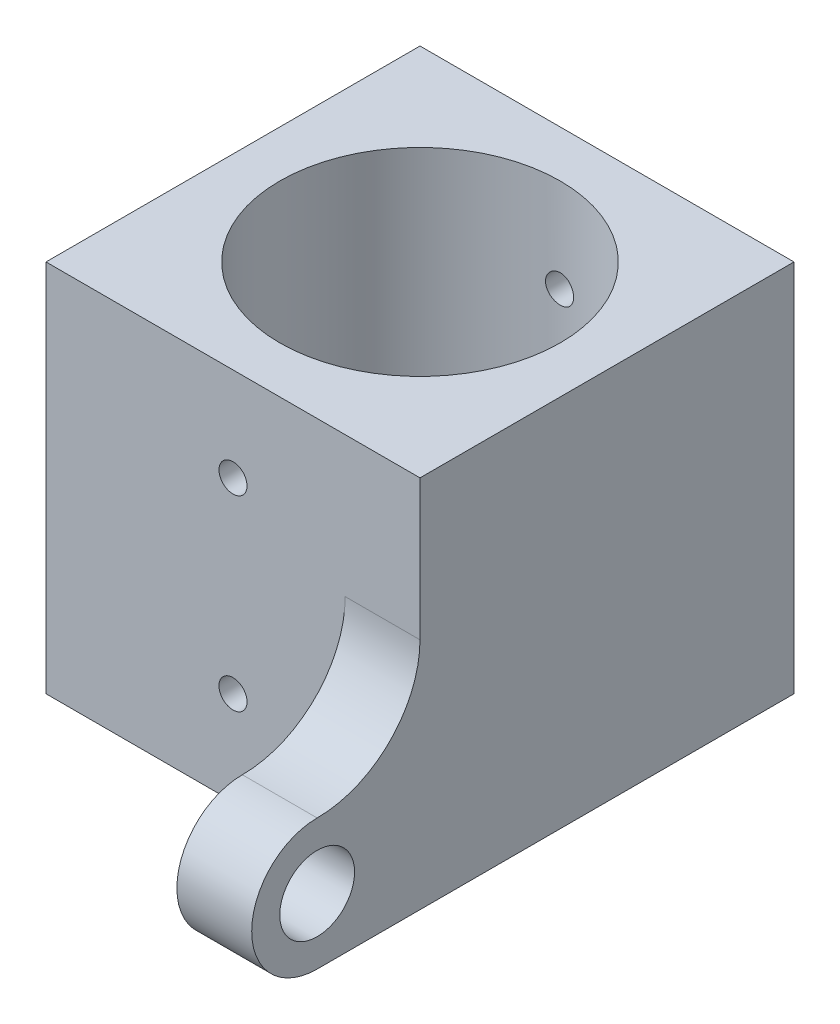
ISO-10303-21;
HEADER;
FILE_DESCRIPTION(('STEP AP214'),'2;1');
FILE_NAME('part.step','',(''),(''),'','','');
FILE_SCHEMA(('AUTOMOTIVE_DESIGN { 1 0 10303 214 1 1 1 1 }'));
ENDSEC;
DATA;
#1=APPLICATION_CONTEXT('core data for automotive mechanical design processes');
#2=APPLICATION_PROTOCOL_DEFINITION('international standard','automotive_design',2000,#1);
#3=PRODUCT_CONTEXT('',#1,'mechanical');
#4=PRODUCT('Part','Part','',(#3));
#5=PRODUCT_RELATED_PRODUCT_CATEGORY('part','',(#4));
#6=PRODUCT_DEFINITION_FORMATION('','',#4);
#7=PRODUCT_DEFINITION_CONTEXT('part definition',#1,'design');
#8=PRODUCT_DEFINITION('design','',#6,#7);
#9=PRODUCT_DEFINITION_SHAPE('','',#8);
#10=(LENGTH_UNIT() NAMED_UNIT(*) SI_UNIT(.MILLI.,.METRE.));
#11=(NAMED_UNIT(*) PLANE_ANGLE_UNIT() SI_UNIT($,.RADIAN.));
#12=(NAMED_UNIT(*) SI_UNIT($,.STERADIAN.) SOLID_ANGLE_UNIT());
#13=UNCERTAINTY_MEASURE_WITH_UNIT(LENGTH_MEASURE(1.E-05),#10,'distance_accuracy_value','');
#14=(GEOMETRIC_REPRESENTATION_CONTEXT(3) GLOBAL_UNCERTAINTY_ASSIGNED_CONTEXT((#13)) GLOBAL_UNIT_ASSIGNED_CONTEXT((#10,
#11,#12)) REPRESENTATION_CONTEXT('',''));
#15=CARTESIAN_POINT('',(0.,0.,0.));
#16=DIRECTION('',(0.,0.,1.));
#17=DIRECTION('',(1.,0.,0.));
#18=AXIS2_PLACEMENT_3D('',#15,#16,#17);
#19=CARTESIAN_POINT('',(0.,40.,0.));
#20=DIRECTION('',(0.,1.,0.));
#21=DIRECTION('',(0.,0.,1.));
#22=AXIS2_PLACEMENT_3D('',#19,#20,#21);
#23=PLANE('',#22);
#24=DIRECTION('',(0.,0.,-1.));
#25=VECTOR('',#24,1.);
#26=CARTESIAN_POINT('',(20.,40.,-20.));
#27=LINE('',#26,#25);
#28=CARTESIAN_POINT('',(20.,40.,20.));
#29=VERTEX_POINT('',#28);
#30=CARTESIAN_POINT('',(20.,40.,-20.));
#31=VERTEX_POINT('',#30);
#32=EDGE_CURVE('E207',#29,#31,#27,.T.);
#33=ORIENTED_EDGE('',*,*,#32,.T.);
#34=DIRECTION('',(-1.,0.,0.));
#35=VECTOR('',#34,1.);
#36=CARTESIAN_POINT('',(-20.,40.,-20.));
#37=LINE('',#36,#35);
#38=CARTESIAN_POINT('',(-20.,40.,-20.));
#39=VERTEX_POINT('',#38);
#40=EDGE_CURVE('E211',#31,#39,#37,.T.);
#41=ORIENTED_EDGE('',*,*,#40,.T.);
#42=DIRECTION('',(0.,0.,1.));
#43=VECTOR('',#42,1.);
#44=CARTESIAN_POINT('',(-20.,40.,-20.));
#45=LINE('',#44,#43);
#46=CARTESIAN_POINT('',(-20.,40.,20.));
#47=VERTEX_POINT('',#46);
#48=EDGE_CURVE('E215',#39,#47,#45,.T.);
#49=ORIENTED_EDGE('',*,*,#48,.T.);
#50=DIRECTION('',(1.,0.,0.));
#51=VECTOR('',#50,1.);
#52=CARTESIAN_POINT('',(-20.,40.,20.));
#53=LINE('',#52,#51);
#54=EDGE_CURVE('E218',#47,#29,#53,.T.);
#55=ORIENTED_EDGE('',*,*,#54,.T.);
#56=EDGE_LOOP('',(#33,#41,#49,#55));
#57=FACE_BOUND('',#56,.T.);
#58=CARTESIAN_POINT('',(0.,40.,0.));
#59=DIRECTION('',(0.,1.,0.));
#60=DIRECTION('',(0.,0.,1.));
#61=AXIS2_PLACEMENT_3D('',#58,#59,#60);
#62=CIRCLE('',#61,15.);
#63=CARTESIAN_POINT('',(0.,40.,15.));
#64=VERTEX_POINT('',#63);
#65=EDGE_CURVE('E199',#64,#64,#62,.T.);
#66=ORIENTED_EDGE('',*,*,#65,.F.);
#67=EDGE_LOOP('',(#66));
#68=FACE_BOUND('',#67,.T.);
#69=ADVANCED_FACE('F39',(#57,#68),#23,.T.);
#70=CARTESIAN_POINT('',(0.,0.,0.));
#71=DIRECTION('',(0.,1.,0.));
#72=DIRECTION('',(0.,0.,1.));
#73=AXIS2_PLACEMENT_3D('',#70,#71,#72);
#74=PLANE('',#73);
#75=DIRECTION('',(0.,0.,-1.));
#76=VECTOR('',#75,1.);
#77=CARTESIAN_POINT('',(20.,0.,-20.));
#78=LINE('',#77,#76);
#79=CARTESIAN_POINT('',(20.,0.,31.));
#80=VERTEX_POINT('',#79);
#81=CARTESIAN_POINT('',(20.,0.,-20.));
#82=VERTEX_POINT('',#81);
#83=EDGE_CURVE('E203',#80,#82,#78,.T.);
#84=ORIENTED_EDGE('',*,*,#83,.F.);
#85=DIRECTION('',(1.,0.,0.));
#86=VECTOR('',#85,1.);
#87=CARTESIAN_POINT('',(12.,0.,31.));
#88=LINE('',#87,#86);
#89=CARTESIAN_POINT('',(12.,0.,31.));
#90=VERTEX_POINT('',#89);
#91=EDGE_CURVE('E108',#90,#80,#88,.T.);
#92=ORIENTED_EDGE('',*,*,#91,.F.);
#93=DIRECTION('',(0.,0.,-1.));
#94=VECTOR('',#93,1.);
#95=CARTESIAN_POINT('',(12.,0.,20.));
#96=LINE('',#95,#94);
#97=CARTESIAN_POINT('',(12.,0.,20.));
#98=VERTEX_POINT('',#97);
#99=EDGE_CURVE('E109',#90,#98,#96,.T.);
#100=ORIENTED_EDGE('',*,*,#99,.T.);
#101=DIRECTION('',(1.,0.,0.));
#102=VECTOR('',#101,1.);
#103=CARTESIAN_POINT('',(-20.,0.,20.));
#104=LINE('',#103,#102);
#105=CARTESIAN_POINT('',(-20.,0.,20.));
#106=VERTEX_POINT('',#105);
#107=EDGE_CURVE('E212',#106,#98,#104,.T.);
#108=ORIENTED_EDGE('',*,*,#107,.F.);
#109=DIRECTION('',(0.,0.,1.));
#110=VECTOR('',#109,1.);
#111=CARTESIAN_POINT('',(-20.,0.,-20.));
#112=LINE('',#111,#110);
#113=CARTESIAN_POINT('',(-20.,0.,-20.));
#114=VERTEX_POINT('',#113);
#115=EDGE_CURVE('E228',#114,#106,#112,.T.);
#116=ORIENTED_EDGE('',*,*,#115,.F.);
#117=DIRECTION('',(-1.,0.,0.));
#118=VECTOR('',#117,1.);
#119=CARTESIAN_POINT('',(-20.,0.,-20.));
#120=LINE('',#119,#118);
#121=EDGE_CURVE('E225',#82,#114,#120,.T.);
#122=ORIENTED_EDGE('',*,*,#121,.F.);
#123=EDGE_LOOP('',(#84,#92,#100,#108,#116,#122));
#124=FACE_BOUND('',#123,.T.);
#125=CARTESIAN_POINT('',(0.,0.,0.));
#126=DIRECTION('',(0.,1.,0.));
#127=DIRECTION('',(0.,0.,1.));
#128=AXIS2_PLACEMENT_3D('',#125,#126,#127);
#129=CIRCLE('',#128,15.);
#130=CARTESIAN_POINT('',(0.,0.,15.));
#131=VERTEX_POINT('',#130);
#132=EDGE_CURVE('E137',#131,#131,#129,.T.);
#133=ORIENTED_EDGE('',*,*,#132,.T.);
#134=EDGE_LOOP('',(#133));
#135=FACE_BOUND('',#134,.T.);
#136=ADVANCED_FACE('F250',(#124,#135),#74,.F.);
#137=CARTESIAN_POINT('',(20.,40.,-20.));
#138=DIRECTION('',(-1.,0.,0.));
#139=DIRECTION('',(0.,0.,1.));
#140=AXIS2_PLACEMENT_3D('',#137,#138,#139);
#141=PLANE('',#140);
#142=ORIENTED_EDGE('',*,*,#83,.T.);
#143=DIRECTION('',(0.,-1.,0.));
#144=VECTOR('',#143,1.);
#145=CARTESIAN_POINT('',(20.,40.,-20.));
#146=LINE('',#145,#144);
#147=EDGE_CURVE('E120',#31,#82,#146,.T.);
#148=ORIENTED_EDGE('',*,*,#147,.F.);
#149=ORIENTED_EDGE('',*,*,#32,.F.);
#150=DIRECTION('',(0.,-1.,0.));
#151=VECTOR('',#150,1.);
#152=CARTESIAN_POINT('',(20.,40.,20.));
#153=LINE('',#152,#151);
#154=CARTESIAN_POINT('',(20.,25.,20.));
#155=VERTEX_POINT('',#154);
#156=EDGE_CURVE('E221',#29,#155,#153,.T.);
#157=ORIENTED_EDGE('',*,*,#156,.T.);
#158=CARTESIAN_POINT('',(20.,25.,31.));
#159=DIRECTION('',(-1.,0.,0.));
#160=DIRECTION('',(0.,0.,1.));
#161=AXIS2_PLACEMENT_3D('',#158,#159,#160);
#162=CIRCLE('',#161,11.);
#163=CARTESIAN_POINT('',(20.,14.,31.));
#164=VERTEX_POINT('',#163);
#165=EDGE_CURVE('E48',#155,#164,#162,.T.);
#166=ORIENTED_EDGE('',*,*,#165,.T.);
#167=CARTESIAN_POINT('',(20.,7.,31.));
#168=DIRECTION('',(1.,0.,0.));
#169=DIRECTION('',(0.,0.,-1.));
#170=AXIS2_PLACEMENT_3D('',#167,#168,#169);
#171=CIRCLE('',#170,7.);
#172=EDGE_CURVE('E105',#164,#80,#171,.T.);
#173=ORIENTED_EDGE('',*,*,#172,.T.);
#174=EDGE_LOOP('',(#142,#148,#149,#157,#166,#173));
#175=FACE_BOUND('',#174,.T.);
#176=CARTESIAN_POINT('',(20.,7.,31.));
#177=DIRECTION('',(1.,0.,0.));
#178=DIRECTION('',(0.,0.,-1.));
#179=AXIS2_PLACEMENT_3D('',#176,#177,#178);
#180=CIRCLE('',#179,4.);
#181=CARTESIAN_POINT('',(20.,7.,27.));
#182=VERTEX_POINT('',#181);
#183=EDGE_CURVE('E271',#182,#182,#180,.T.);
#184=ORIENTED_EDGE('',*,*,#183,.F.);
#185=EDGE_LOOP('',(#184));
#186=FACE_BOUND('',#185,.T.);
#187=ADVANCED_FACE('F260',(#175,#186),#141,.F.);
#188=CARTESIAN_POINT('',(-20.,40.,-20.));
#189=DIRECTION('',(0.,0.,1.));
#190=DIRECTION('',(1.,0.,0.));
#191=AXIS2_PLACEMENT_3D('',#188,#189,#190);
#192=PLANE('',#191);
#193=CARTESIAN_POINT('',(0.,10.,-20.));
#194=DIRECTION('',(0.,0.,1.));
#195=DIRECTION('',(1.,0.,0.));
#196=AXIS2_PLACEMENT_3D('',#193,#194,#195);
#197=CIRCLE('',#196,1.5);
#198=CARTESIAN_POINT('',(1.5,10.,-20.));
#199=VERTEX_POINT('',#198);
#200=EDGE_CURVE('E178',#199,#199,#197,.T.);
#201=ORIENTED_EDGE('',*,*,#200,.T.);
#202=EDGE_LOOP('',(#201));
#203=FACE_BOUND('',#202,.T.);
#204=CARTESIAN_POINT('',(0.,30.,-20.));
#205=DIRECTION('',(0.,0.,1.));
#206=DIRECTION('',(1.,0.,0.));
#207=AXIS2_PLACEMENT_3D('',#204,#205,#206);
#208=CIRCLE('',#207,1.5);
#209=CARTESIAN_POINT('',(1.5,30.,-20.));
#210=VERTEX_POINT('',#209);
#211=EDGE_CURVE('E188',#210,#210,#208,.T.);
#212=ORIENTED_EDGE('',*,*,#211,.T.);
#213=EDGE_LOOP('',(#212));
#214=FACE_BOUND('',#213,.T.);
#215=ORIENTED_EDGE('',*,*,#121,.T.);
#216=DIRECTION('',(0.,-1.,0.));
#217=VECTOR('',#216,1.);
#218=CARTESIAN_POINT('',(-20.,40.,-20.));
#219=LINE('',#218,#217);
#220=EDGE_CURVE('E125',#39,#114,#219,.T.);
#221=ORIENTED_EDGE('',*,*,#220,.F.);
#222=ORIENTED_EDGE('',*,*,#40,.F.);
#223=ORIENTED_EDGE('',*,*,#147,.T.);
#224=EDGE_LOOP('',(#215,#221,#222,#223));
#225=FACE_BOUND('',#224,.T.);
#226=ADVANCED_FACE('F258',(#203,#214,#225),#192,.F.);
#227=CARTESIAN_POINT('',(-20.,40.,-20.));
#228=DIRECTION('',(1.,0.,0.));
#229=DIRECTION('',(0.,0.,-1.));
#230=AXIS2_PLACEMENT_3D('',#227,#228,#229);
#231=PLANE('',#230);
#232=ORIENTED_EDGE('',*,*,#115,.T.);
#233=DIRECTION('',(0.,-1.,0.));
#234=VECTOR('',#233,1.);
#235=CARTESIAN_POINT('',(-20.,40.,20.));
#236=LINE('',#235,#234);
#237=EDGE_CURVE('E235',#47,#106,#236,.T.);
#238=ORIENTED_EDGE('',*,*,#237,.F.);
#239=ORIENTED_EDGE('',*,*,#48,.F.);
#240=ORIENTED_EDGE('',*,*,#220,.T.);
#241=EDGE_LOOP('',(#232,#238,#239,#240));
#242=FACE_BOUND('',#241,.T.);
#243=ADVANCED_FACE('F245',(#242),#231,.F.);
#244=CARTESIAN_POINT('',(-20.,40.,20.));
#245=DIRECTION('',(0.,0.,-1.));
#246=DIRECTION('',(-1.,0.,0.));
#247=AXIS2_PLACEMENT_3D('',#244,#245,#246);
#248=PLANE('',#247);
#249=CARTESIAN_POINT('',(0.,10.,20.));
#250=DIRECTION('',(0.,0.,1.));
#251=DIRECTION('',(1.,0.,0.));
#252=AXIS2_PLACEMENT_3D('',#249,#250,#251);
#253=CIRCLE('',#252,1.5);
#254=CARTESIAN_POINT('',(1.5,10.,20.));
#255=VERTEX_POINT('',#254);
#256=EDGE_CURVE('E182',#255,#255,#253,.T.);
#257=ORIENTED_EDGE('',*,*,#256,.F.);
#258=EDGE_LOOP('',(#257));
#259=FACE_BOUND('',#258,.T.);
#260=CARTESIAN_POINT('',(0.,30.,20.));
#261=DIRECTION('',(0.,0.,1.));
#262=DIRECTION('',(1.,0.,0.));
#263=AXIS2_PLACEMENT_3D('',#260,#261,#262);
#264=CIRCLE('',#263,1.5);
#265=CARTESIAN_POINT('',(1.5,30.,20.));
#266=VERTEX_POINT('',#265);
#267=EDGE_CURVE('E195',#266,#266,#264,.T.);
#268=ORIENTED_EDGE('',*,*,#267,.F.);
#269=EDGE_LOOP('',(#268));
#270=FACE_BOUND('',#269,.T.);
#271=DIRECTION('',(0.,1.,0.));
#272=VECTOR('',#271,1.);
#273=CARTESIAN_POINT('',(12.,14.,20.));
#274=LINE('',#273,#272);
#275=CARTESIAN_POINT('',(12.,25.,20.));
#276=VERTEX_POINT('',#275);
#277=EDGE_CURVE('E55',#98,#276,#274,.T.);
#278=ORIENTED_EDGE('',*,*,#277,.T.);
#279=DIRECTION('',(1.,0.,0.));
#280=VECTOR('',#279,1.);
#281=CARTESIAN_POINT('',(-20.,25.,20.));
#282=LINE('',#281,#280);
#283=EDGE_CURVE('E116',#276,#155,#282,.T.);
#284=ORIENTED_EDGE('',*,*,#283,.T.);
#285=ORIENTED_EDGE('',*,*,#156,.F.);
#286=ORIENTED_EDGE('',*,*,#54,.F.);
#287=ORIENTED_EDGE('',*,*,#237,.T.);
#288=ORIENTED_EDGE('',*,*,#107,.T.);
#289=EDGE_LOOP('',(#278,#284,#285,#286,#287,#288));
#290=FACE_BOUND('',#289,.T.);
#291=ADVANCED_FACE('F252',(#259,#270,#290),#248,.F.);
#292=CARTESIAN_POINT('',(0.,40.,0.));
#293=DIRECTION('',(0.,-1.,0.));
#294=DIRECTION('',(0.,0.,-1.));
#295=AXIS2_PLACEMENT_3D('',#292,#293,#294);
#296=CYLINDRICAL_SURFACE('',#295,15.);
#297=CARTESIAN_POINT('',(0.,11.5,-15.));
#298=CARTESIAN_POINT('',(-0.0840305306873392,11.4999963611494,-14.9999990328115));
#299=CARTESIAN_POINT('',(-0.168116617751663,11.4929150966553,-14.9992863839431));
#300=CARTESIAN_POINT('',(-0.333957597745259,11.4647734445644,-14.9965120139211));
#301=CARTESIAN_POINT('',(-0.415709818753245,11.4436976559631,-14.9944488065104));
#302=CARTESIAN_POINT('',(-0.574457513180126,11.3881866391032,-14.9892062184461));
#303=CARTESIAN_POINT('',(-0.651455826922369,11.3537594792223,-14.9860275120106));
#304=CARTESIAN_POINT('',(-0.798564241440614,11.2725386381025,-14.9789093609146));
#305=CARTESIAN_POINT('',(-0.868675708168619,11.2257474159998,-14.974970067572));
#306=CARTESIAN_POINT('',(-1.00028932601113,11.1209459535066,-14.9667561651199));
#307=CARTESIAN_POINT('',(-1.06176321725234,11.0629003008969,-14.962480523608));
#308=CARTESIAN_POINT('',(-1.17411378214648,10.9373131986055,-14.9540843535939));
#309=CARTESIAN_POINT('',(-1.22498996562398,10.8697713099364,-14.9499638322738));
#310=CARTESIAN_POINT('',(-1.31480095566543,10.7269322024746,-14.9423338732918));
#311=CARTESIAN_POINT('',(-1.35371019818232,10.6516188338577,-14.9388257506636));
#312=CARTESIAN_POINT('',(-1.41831957711414,10.4954866211425,-14.9328305631979));
#313=CARTESIAN_POINT('',(-1.44402003988694,10.4146679131241,-14.9303434731333));
#314=CARTESIAN_POINT('',(-1.48139856240284,10.250107298701,-14.9266812610947));
#315=CARTESIAN_POINT('',(-1.49312347950569,10.1663761347217,-14.9255017559714));
#316=CARTESIAN_POINT('',(-1.50236292770304,9.99812670490633,-14.9245746459079));
#317=CARTESIAN_POINT('',(-1.4998778323062,9.91360845981691,-14.9248270033312));
#318=CARTESIAN_POINT('',(-1.48080642037902,9.74650703546002,-14.926731103484));
#319=CARTESIAN_POINT('',(-1.46427126618683,9.66391795100695,-14.9283777688598));
#320=CARTESIAN_POINT('',(-1.41764871622588,9.50269305519835,-14.9328770143113));
#321=CARTESIAN_POINT('',(-1.38756113738362,9.42405729726245,-14.9357296106774));
#322=CARTESIAN_POINT('',(-1.31463134082226,9.27280961905166,-14.9423251417811));
#323=CARTESIAN_POINT('',(-1.27176642407997,9.20020871576602,-14.9460696586224));
#324=CARTESIAN_POINT('',(-1.17451504102984,9.06321217763217,-14.9540257759932));
#325=CARTESIAN_POINT('',(-1.12012823750476,8.99881678302735,-14.9582373901918));
#326=CARTESIAN_POINT('',(-1.0010911686181,8.87976190901646,-14.9666757796948));
#327=CARTESIAN_POINT('',(-0.936396718277042,8.82514659717879,-14.970902539995));
#328=CARTESIAN_POINT('',(-0.798734222605665,8.72754455063441,-14.9788774361778));
#329=CARTESIAN_POINT('',(-0.725766167999397,8.68455782896528,-14.9826255715238));
#330=CARTESIAN_POINT('',(-0.573597158538543,8.61143496953462,-14.9892221350064));
#331=CARTESIAN_POINT('',(-0.494395119584851,8.58130107277291,-14.9920704062215));
#332=CARTESIAN_POINT('',(-0.332020825994894,8.53477162493237,-14.9965447116211));
#333=CARTESIAN_POINT('',(-0.248848690164896,8.51837566301407,-14.9981707823559));
#334=CARTESIAN_POINT('',(-0.0812776486378511,8.49984353839785,-15.0000127750247));
#335=CARTESIAN_POINT('',(0.00311445315824251,8.49764642762125,-15.000234724016));
#336=CARTESIAN_POINT('',(0.171065689973554,8.50741429457315,-14.999259626352));
#337=CARTESIAN_POINT('',(0.254624836230709,8.51937908097292,-14.998062598867));
#338=CARTESIAN_POINT('',(0.418362310252016,8.55708054313236,-14.9943879230879));
#339=CARTESIAN_POINT('',(0.498547273458033,8.58278868171702,-14.9919129287706));
#340=CARTESIAN_POINT('',(0.653466482075677,8.64721776105591,-14.9859599829091));
#341=CARTESIAN_POINT('',(0.72820060523568,8.6859389935591,-14.9824820088788));
#342=CARTESIAN_POINT('',(0.870372270258217,8.77544625799587,-14.9748971299563));
#343=CARTESIAN_POINT('',(0.937784489623379,8.82627233338873,-14.9707881540516));
#344=CARTESIAN_POINT('',(1.06314243496782,8.93848910161139,-14.9624089930428));
#345=CARTESIAN_POINT('',(1.12108792327377,8.99988005960548,-14.9581388038946));
#346=CARTESIAN_POINT('',(1.22607916483072,9.1317498619885,-14.9499003621113));
#347=CARTESIAN_POINT('',(1.27308491801932,9.20226063481394,-14.9459332520846));
#348=CARTESIAN_POINT('',(1.35458738811574,9.35021104022003,-14.9387674869133));
#349=CARTESIAN_POINT('',(1.38908427608082,9.4276505780326,-14.9355688212606));
#350=CARTESIAN_POINT('',(1.44452281302671,9.58712310919869,-14.9303092145107));
#351=CARTESIAN_POINT('',(1.46548826221779,9.66914776013668,-14.9282462767468));
#352=CARTESIAN_POINT('',(1.49334601069419,9.83557479694116,-14.9254854792431));
#353=CARTESIAN_POINT('',(1.50023871359928,9.91997711454352,-14.9247875803528));
#354=CARTESIAN_POINT('',(1.49974970770688,10.0883660325351,-14.9248366966134));
#355=CARTESIAN_POINT('',(1.49243083438967,10.1723528243242,-14.9255773513051));
#356=CARTESIAN_POINT('',(1.46385817944548,10.3378973757524,-14.9284065583432));
#357=CARTESIAN_POINT('',(1.44260438214324,10.419455132659,-14.9304951122058));
#358=CARTESIAN_POINT('',(1.38678252944625,10.5778260235718,-14.9357830239478));
#359=CARTESIAN_POINT('',(1.35221631651137,10.6546398124446,-14.9389822281054));
#360=CARTESIAN_POINT('',(1.27075733236656,10.8013853375066,-14.9461312775904));
#361=CARTESIAN_POINT('',(1.22386463018312,10.8713171122309,-14.9500811187143));
#362=CARTESIAN_POINT('',(1.11884783442799,11.0026355117079,-14.9583073081455));
#363=CARTESIAN_POINT('',(1.0606769233354,11.0639846145506,-14.9625849709013));
#364=CARTESIAN_POINT('',(0.93484754883766,11.1760783490495,-14.9709728209317));
#365=CARTESIAN_POINT('',(0.867186816162381,11.2268204370358,-14.9750829678446));
#366=CARTESIAN_POINT('',(0.724112151241929,11.3163601807819,-14.9826834310374));
#367=CARTESIAN_POINT('',(0.648679124020141,11.3551274364178,-14.9861721604022));
#368=CARTESIAN_POINT('',(0.492387418650822,11.4193936342358,-14.9921194387484));
#369=CARTESIAN_POINT('',(0.411534974738409,11.4449075364303,-14.9945791486448));
#370=CARTESIAN_POINT('',(0.275187392108551,11.4755809256272,-14.997573206606));
#371=CARTESIAN_POINT('',(0.220563829266758,11.484725566449,-14.9984790103775));
#372=CARTESIAN_POINT('',(0.110634871225965,11.4969362890926,-14.9996927242618));
#373=CARTESIAN_POINT('',(0.0553294788398327,11.5000023959828,-15.0000006368404));
#374=CARTESIAN_POINT('',(0.,11.5,-15.));
#375=B_SPLINE_CURVE_WITH_KNOTS('',3,(#297,#298,#299,#300,#301,#302,#303,#304,#305,#306,#307,
#308,#309,#310,#311,#312,#313,#314,#315,#316,#317,#318,#319,#320,#321,#322,#323,#324,#325,#326,
#327,#328,#329,#330,#331,#332,#333,#334,#335,#336,#337,#338,#339,#340,#341,#342,#343,#344,#345,
#346,#347,#348,#349,#350,#351,#352,#353,#354,#355,#356,#357,#358,#359,#360,#361,#362,#363,#364,
#365,#366,#367,#368,#369,#370,#371,#372,#373,#374),.UNSPECIFIED.,.T.,.F.,(4,2,2,2,2,2,2,2,2,2,2,
2,2,2,2,2,2,2,2,2,2,2,2,2,2,2,2,2,2,2,2,2,2,2,2,2,2,2,4),(0.,0.251889549402711,0.50405676425323,
0.756071828598306,1.00803680637417,1.26080785293442,1.51359058831059,1.76690963208333,
2.02022241663756,2.27268348067795,2.52513790883665,2.77667696161666,3.02821941242451,
3.28021142059342,3.53221080496688,3.7853210129431,4.03843150469658,4.29158611040372,
4.54473314513159,4.79679282911637,5.04884910778715,5.30038402941457,5.551924590742,
5.80430911123048,6.05669996715345,6.30999965412898,6.56329587713061,6.81614535889505,
7.06898758859378,7.32071443940935,7.5724415733906,7.824133880442,8.0758247780844,
8.3285837614148,8.58140328955437,8.83485946539364,9.08802892192943,9.25388500848523,
9.41974041103541),.UNSPECIFIED.);
#376=CARTESIAN_POINT('',(0.,11.5,-15.));
#377=VERTEX_POINT('',#376);
#378=EDGE_CURVE('E128',#377,#377,#375,.T.);
#379=ORIENTED_EDGE('',*,*,#378,.F.);
#380=EDGE_LOOP('',(#379));
#381=FACE_BOUND('',#380,.T.);
#382=CARTESIAN_POINT('',(1.5,10.,14.9248115565993));
#383=CARTESIAN_POINT('',(1.49999636009027,9.9159706537396,14.9248125419535));
#384=CARTESIAN_POINT('',(1.49291528847371,9.83188574738224,14.9255288549133));
#385=CARTESIAN_POINT('',(1.46477447214534,9.6660472205597,14.9283163133718));
#386=CARTESIAN_POINT('',(1.44369932232965,9.58429627294377,14.9303889519183));
#387=CARTESIAN_POINT('',(1.38819017410339,9.42555127117314,14.9356519957108));
#388=CARTESIAN_POINT('',(1.35376427444085,9.34855436591284,14.9388417232018));
#389=CARTESIAN_POINT('',(1.27254640108665,9.20144831156238,14.9459787085773));
#390=CARTESIAN_POINT('',(1.22575688343889,9.13133779827442,14.9499258159649));
#391=CARTESIAN_POINT('',(1.12095714299806,8.99972310451375,14.9581489006485));
#392=CARTESIAN_POINT('',(1.06291112716239,8.93824748574433,14.962425900079));
#393=CARTESIAN_POINT('',(0.937322572979347,8.82589358649465,14.9708175785358));
#394=CARTESIAN_POINT('',(0.869779600359853,8.77501579089054,14.9749322501282));
#395=CARTESIAN_POINT('',(0.726939542476482,8.68520311448927,14.9825457473341));
#396=CARTESIAN_POINT('',(0.651626493794355,8.6462935018095,14.9860432634197));
#397=CARTESIAN_POINT('',(0.495494976431266,8.58168335027698,14.9920172531366));
#398=CARTESIAN_POINT('',(0.414676642002328,8.5559824894458,14.994493751656));
#399=CARTESIAN_POINT('',(0.250117174114424,8.51860313597013,14.9981394985654));
#400=CARTESIAN_POINT('',(0.166386790547372,8.50687775087508,14.9993131176423));
#401=CARTESIAN_POINT('',(-0.00186111103341447,8.49763709629942,15.0002357339804));
#402=CARTESIAN_POINT('',(-0.0863786085816918,8.50012145838059,14.9999847681791));
#403=CARTESIAN_POINT('',(-0.25348326609684,8.51919170897523,14.9980900696678));
#404=CARTESIAN_POINT('',(-0.336076244902468,8.53572717334584,14.9964513172757));
#405=CARTESIAN_POINT('',(-0.497308769256799,8.58235169341993,14.991970938974));
#406=CARTESIAN_POINT('',(-0.575948263436592,8.61244092518136,14.9891292974393));
#407=CARTESIAN_POINT('',(-0.727200472019379,8.68537414488166,14.9825540622587));
#408=CARTESIAN_POINT('',(-0.799802356472475,8.72824044629523,14.9788189104864));
#409=CARTESIAN_POINT('',(-0.93680026976129,8.82549478500455,14.9708757677911));
#410=CARTESIAN_POINT('',(-1.00119605784124,8.87988316021777,14.9666677630022));
#411=CARTESIAN_POINT('',(-1.12024915773403,8.99892134427047,14.9582294020178));
#412=CARTESIAN_POINT('',(-1.17486261928552,9.06361501711236,14.9539990285954));
#413=CARTESIAN_POINT('',(-1.27246130303688,9.20127529781616,14.9460110989233));
#414=CARTESIAN_POINT('',(-1.31544650836933,9.27424191767821,14.9422535433595));
#415=CARTESIAN_POINT('',(-1.38856827685984,9.42641053779968,14.9356363427122));
#416=CARTESIAN_POINT('',(-1.41870213085944,9.50561384863433,14.9327768869883));
#417=CARTESIAN_POINT('',(-1.46523110345638,9.66799090692203,14.9282835280641));
#418=CARTESIAN_POINT('',(-1.48162664061455,9.75116453333117,14.9266495875265));
#419=CARTESIAN_POINT('',(-1.50015716308794,9.91873626929426,14.9247987079113));
#420=CARTESIAN_POINT('',(-1.50235349497082,10.0031275303972,14.924575673214));
#421=CARTESIAN_POINT('',(-1.49258437030704,10.1710768987343,14.9255557703216));
#422=CARTESIAN_POINT('',(-1.48061910511463,10.2546350172105,14.9267588828559));
#423=CARTESIAN_POINT('',(-1.44291776176128,10.4183673734175,14.930450166336));
#424=CARTESIAN_POINT('',(-1.41721069078336,10.498548356642,14.9329356300202));
#425=CARTESIAN_POINT('',(-1.35278507951391,10.6534600775955,14.9389093655819));
#426=CARTESIAN_POINT('',(-1.31406624117538,10.7281906904308,14.94239766043));
#427=CARTESIAN_POINT('',(-1.22456250213483,10.8703599610432,14.9499987653357));
#428=CARTESIAN_POINT('',(-1.17373694976104,10.9377729129494,14.9541136622201));
#429=CARTESIAN_POINT('',(-1.06152080017676,11.0631325799111,14.9624974893778));
#430=CARTESIAN_POINT('',(-1.0001299413722,11.1210790605101,14.966766423463));
#431=CARTESIAN_POINT('',(-0.868259706339712,11.2260724500971,14.9749957177395));
#432=CARTESIAN_POINT('',(-0.797748383954179,11.2730793393793,14.9789549108321));
#433=CARTESIAN_POINT('',(-0.649796576125697,11.3545838027596,14.9861016315995));
#434=CARTESIAN_POINT('',(-0.572356185644438,11.3890815482607,14.9892891698474));
#435=CARTESIAN_POINT('',(-0.412884189649223,11.444520651483,14.9945281562101));
#436=CARTESIAN_POINT('',(-0.33086105647494,11.4654861809878,14.9965816290847));
#437=CARTESIAN_POINT('',(-0.16443722097552,11.4933446043698,14.9993294192047));
#438=CARTESIAN_POINT('',(-0.0800365855383278,11.5002378937511,15.0000237746484));
#439=CARTESIAN_POINT('',(0.0883533361136183,11.4997506003401,14.999975074699));
#440=CARTESIAN_POINT('',(0.17234281083679,11.492432144745,14.99923827565));
#441=CARTESIAN_POINT('',(0.337892832534542,11.4638593815145,14.9964224036639));
#442=CARTESIAN_POINT('',(0.419453377602547,11.4426050629405,14.9943433296731));
#443=CARTESIAN_POINT('',(0.577829863151614,11.3867811139106,14.9890758572094));
#444=CARTESIAN_POINT('',(0.654646449116291,11.3522132995988,14.9858876100487));
#445=CARTESIAN_POINT('',(0.801396900232192,11.2707502466245,14.9787571862444));
#446=CARTESIAN_POINT('',(0.871330805652837,11.2238550800933,14.9748150140123));
#447=CARTESIAN_POINT('',(1.00264908664041,11.1188355714644,14.9665977700358));
#448=CARTESIAN_POINT('',(1.06399638932901,11.0606649756328,14.9623213719105));
#449=CARTESIAN_POINT('',(1.17608663908971,10.9348369726818,14.9539288615449));
#450=CARTESIAN_POINT('',(1.22682703777177,10.8671772922464,14.9498127880167));
#451=CARTESIAN_POINT('',(1.31636496063608,10.7241034871201,14.942195751159));
#452=CARTESIAN_POINT('',(1.35513178199225,10.6486700780139,14.9386963788796));
#453=CARTESIAN_POINT('',(1.41939706214815,10.4923775631307,14.9327279214369));
#454=CARTESIAN_POINT('',(1.44491048683479,10.4115246941114,14.9302576748004));
#455=CARTESIAN_POINT('',(1.47558253250029,10.2751783886513,14.9272501130722));
#456=CARTESIAN_POINT('',(1.48472656859734,10.2205566230404,14.9263399790354));
#457=CARTESIAN_POINT('',(1.49693648790767,10.1106312654362,14.9251203776649));
#458=CARTESIAN_POINT('',(1.5000023966359,10.0553276763061,14.9248109078098));
#459=CARTESIAN_POINT('',(1.5,10.,14.9248115565993));
#460=B_SPLINE_CURVE_WITH_KNOTS('',3,(#382,#383,#384,#385,#386,#387,#388,#389,#390,#391,#392,
#393,#394,#395,#396,#397,#398,#399,#400,#401,#402,#403,#404,#405,#406,#407,#408,#409,#410,#411,
#412,#413,#414,#415,#416,#417,#418,#419,#420,#421,#422,#423,#424,#425,#426,#427,#428,#429,#430,
#431,#432,#433,#434,#435,#436,#437,#438,#439,#440,#441,#442,#443,#444,#445,#446,#447,#448,#449,
#450,#451,#452,#453,#454,#455,#456,#457,#458,#459),.UNSPECIFIED.,.T.,.F.,(4,2,2,2,2,2,2,2,2,2,2,
2,2,2,2,2,2,2,2,2,2,2,2,2,2,2,2,2,2,2,2,2,2,2,2,2,2,2,4),(0.,0.251885991654691,
0.504049727732654,0.756060736496211,1.00802172063197,1.26079742294888,1.51358468782879,
1.76690204956937,2.02021323611692,2.27267206347674,2.52512434497348,2.77667447727992,
3.02822787721461,3.2802231819962,3.53222587827793,3.78533137627502,4.03843724141344,
4.291596436769,4.54474791892549,4.79680494461648,5.04885856450305,5.30038222056791,
5.55191163841571,5.80429784717577,6.05669030584804,6.30999205227177,6.56329032777007,
6.81613489041542,7.06897234669724,7.32070700202724,7.57244185494987,7.82414237992869,
8.07584143216198,8.32859572556983,8.58141067551787,8.83486861605715,9.08803972341001,
9.2538904140907,9.41974040855723),.UNSPECIFIED.);
#461=CARTESIAN_POINT('',(1.5,10.,14.9248115565993));
#462=VERTEX_POINT('',#461);
#463=EDGE_CURVE('E138',#462,#462,#460,.T.);
#464=ORIENTED_EDGE('',*,*,#463,.F.);
#465=EDGE_LOOP('',(#464));
#466=FACE_BOUND('',#465,.T.);
#467=CARTESIAN_POINT('',(0.,31.5,-15.));
#468=CARTESIAN_POINT('',(-0.084030530687339,31.4999963611494,-14.9999990328115));
#469=CARTESIAN_POINT('',(-0.168116617751663,31.4929150966553,-14.9992863839431));
#470=CARTESIAN_POINT('',(-0.333957597745258,31.4647734445644,-14.9965120139211));
#471=CARTESIAN_POINT('',(-0.415709818753244,31.4436976559631,-14.9944488065104));
#472=CARTESIAN_POINT('',(-0.574457513180124,31.3881866391032,-14.9892062184461));
#473=CARTESIAN_POINT('',(-0.651455826922367,31.3537594792223,-14.9860275120106));
#474=CARTESIAN_POINT('',(-0.798564241440613,31.2725386381025,-14.9789093609146));
#475=CARTESIAN_POINT('',(-0.868675708168616,31.2257474159998,-14.974970067572));
#476=CARTESIAN_POINT('',(-1.00028932601112,31.1209459535066,-14.9667561651199));
#477=CARTESIAN_POINT('',(-1.06176321725234,31.0629003008969,-14.962480523608));
#478=CARTESIAN_POINT('',(-1.17411378214648,30.9373131986055,-14.9540843535939));
#479=CARTESIAN_POINT('',(-1.22498996562398,30.8697713099364,-14.9499638322738));
#480=CARTESIAN_POINT('',(-1.31480095566543,30.7269322024746,-14.9423338732918));
#481=CARTESIAN_POINT('',(-1.35371019818232,30.6516188338577,-14.9388257506636));
#482=CARTESIAN_POINT('',(-1.41831957711414,30.4954866211425,-14.9328305631979));
#483=CARTESIAN_POINT('',(-1.44402003988694,30.4146679131241,-14.9303434731333));
#484=CARTESIAN_POINT('',(-1.48139856240284,30.250107298701,-14.9266812610947));
#485=CARTESIAN_POINT('',(-1.49312347950569,30.1663761347217,-14.9255017559714));
#486=CARTESIAN_POINT('',(-1.50236292770304,29.9981267049063,-14.9245746459079));
#487=CARTESIAN_POINT('',(-1.4998778323062,29.9136084598169,-14.9248270033312));
#488=CARTESIAN_POINT('',(-1.48080642037902,29.74650703546,-14.926731103484));
#489=CARTESIAN_POINT('',(-1.46427126618683,29.663917951007,-14.9283777688598));
#490=CARTESIAN_POINT('',(-1.41764871622588,29.5026930551984,-14.9328770143113));
#491=CARTESIAN_POINT('',(-1.38756113738362,29.4240572972625,-14.9357296106774));
#492=CARTESIAN_POINT('',(-1.31463134082226,29.2728096190517,-14.9423251417811));
#493=CARTESIAN_POINT('',(-1.27176642407997,29.200208715766,-14.9460696586224));
#494=CARTESIAN_POINT('',(-1.17451504102984,29.0632121776322,-14.9540257759932));
#495=CARTESIAN_POINT('',(-1.12012823750476,28.9988167830274,-14.9582373901918));
#496=CARTESIAN_POINT('',(-1.0010911686181,28.8797619090165,-14.9666757796948));
#497=CARTESIAN_POINT('',(-0.936396718277045,28.8251465971788,-14.970902539995));
#498=CARTESIAN_POINT('',(-0.798734222605668,28.7275445506344,-14.9788774361778));
#499=CARTESIAN_POINT('',(-0.7257661679994,28.6845578289653,-14.9826255715238));
#500=CARTESIAN_POINT('',(-0.573597158538544,28.6114349695346,-14.9892221350064));
#501=CARTESIAN_POINT('',(-0.494395119584852,28.5813010727729,-14.9920704062215));
#502=CARTESIAN_POINT('',(-0.332020825994895,28.5347716249324,-14.9965447116211));
#503=CARTESIAN_POINT('',(-0.248848690164897,28.5183756630141,-14.9981707823559));
#504=CARTESIAN_POINT('',(-0.0812776486378519,28.4998435383979,-15.0000127750247));
#505=CARTESIAN_POINT('',(0.00311445315824136,28.4976464276212,-15.000234724016));
#506=CARTESIAN_POINT('',(0.171065689973553,28.5074142945731,-14.999259626352));
#507=CARTESIAN_POINT('',(0.254624836230708,28.5193790809729,-14.998062598867));
#508=CARTESIAN_POINT('',(0.418362310252015,28.5570805431324,-14.9943879230879));
#509=CARTESIAN_POINT('',(0.498547273458031,28.582788681717,-14.9919129287706));
#510=CARTESIAN_POINT('',(0.653466482075675,28.6472177610559,-14.9859599829091));
#511=CARTESIAN_POINT('',(0.728200605235679,28.6859389935591,-14.9824820088788));
#512=CARTESIAN_POINT('',(0.870372270258217,28.7754462579959,-14.9748971299563));
#513=CARTESIAN_POINT('',(0.937784489623378,28.8262723333887,-14.9707881540516));
#514=CARTESIAN_POINT('',(1.06314243496782,28.9384891016114,-14.9624089930428));
#515=CARTESIAN_POINT('',(1.12108792327377,28.9998800596055,-14.9581388038946));
#516=CARTESIAN_POINT('',(1.22607916483072,29.1317498619885,-14.9499003621113));
#517=CARTESIAN_POINT('',(1.27308491801932,29.2022606348139,-14.9459332520846));
#518=CARTESIAN_POINT('',(1.35458738811574,29.35021104022,-14.9387674869133));
#519=CARTESIAN_POINT('',(1.38908427608082,29.4276505780326,-14.9355688212606));
#520=CARTESIAN_POINT('',(1.44452281302671,29.5871231091987,-14.9303092145107));
#521=CARTESIAN_POINT('',(1.46548826221779,29.6691477601367,-14.9282462767468));
#522=CARTESIAN_POINT('',(1.49334601069419,29.8355747969412,-14.9254854792431));
#523=CARTESIAN_POINT('',(1.50023871359928,29.9199771145435,-14.9247875803528));
#524=CARTESIAN_POINT('',(1.49974970770688,30.0883660325351,-14.9248366966134));
#525=CARTESIAN_POINT('',(1.49243083438967,30.1723528243242,-14.9255773513051));
#526=CARTESIAN_POINT('',(1.46385817944548,30.3378973757524,-14.9284065583432));
#527=CARTESIAN_POINT('',(1.44260438214324,30.419455132659,-14.9304951122058));
#528=CARTESIAN_POINT('',(1.38678252944625,30.5778260235718,-14.9357830239478));
#529=CARTESIAN_POINT('',(1.35221631651137,30.6546398124446,-14.9389822281054));
#530=CARTESIAN_POINT('',(1.27075733236656,30.8013853375066,-14.9461312775904));
#531=CARTESIAN_POINT('',(1.22386463018312,30.8713171122309,-14.9500811187143));
#532=CARTESIAN_POINT('',(1.11884783442799,31.0026355117079,-14.9583073081455));
#533=CARTESIAN_POINT('',(1.0606769233354,31.0639846145506,-14.9625849709013));
#534=CARTESIAN_POINT('',(0.934847548837663,31.1760783490495,-14.9709728209317));
#535=CARTESIAN_POINT('',(0.867186816162386,31.2268204370358,-14.9750829678446));
#536=CARTESIAN_POINT('',(0.724112151241936,31.3163601807819,-14.9826834310374));
#537=CARTESIAN_POINT('',(0.648679124020146,31.3551274364178,-14.9861721604022));
#538=CARTESIAN_POINT('',(0.492387418650824,31.4193936342358,-14.9921194387484));
#539=CARTESIAN_POINT('',(0.411534974738411,31.4449075364303,-14.9945791486448));
#540=CARTESIAN_POINT('',(0.275187392108553,31.4755809256272,-14.997573206606));
#541=CARTESIAN_POINT('',(0.220563829266759,31.484725566449,-14.9984790103775));
#542=CARTESIAN_POINT('',(0.110634871225965,31.4969362890926,-14.9996927242618));
#543=CARTESIAN_POINT('',(0.0553294788398329,31.5000023959828,-15.0000006368404));
#544=CARTESIAN_POINT('',(0.,31.5,-15.));
#545=B_SPLINE_CURVE_WITH_KNOTS('',3,(#467,#468,#469,#470,#471,#472,#473,#474,#475,#476,#477,
#478,#479,#480,#481,#482,#483,#484,#485,#486,#487,#488,#489,#490,#491,#492,#493,#494,#495,#496,
#497,#498,#499,#500,#501,#502,#503,#504,#505,#506,#507,#508,#509,#510,#511,#512,#513,#514,#515,
#516,#517,#518,#519,#520,#521,#522,#523,#524,#525,#526,#527,#528,#529,#530,#531,#532,#533,#534,
#535,#536,#537,#538,#539,#540,#541,#542,#543,#544),.UNSPECIFIED.,.T.,.F.,(4,2,2,2,2,2,2,2,2,2,2,
2,2,2,2,2,2,2,2,2,2,2,2,2,2,2,2,2,2,2,2,2,2,2,2,2,2,2,4),(0.,0.251889549402709,0.50405676425323,
0.756071828598302,1.00803680637417,1.26080785293442,1.51359058831059,1.76690963208333,
2.02022241663756,2.27268348067795,2.52513790883665,2.77667696161665,3.0282194124245,
3.28021142059342,3.53221080496688,3.7853210129431,4.03843150469658,4.29158611040372,
4.54473314513159,4.79679282911637,5.04884910778715,5.30038402941457,5.55192459074201,
5.80430911123048,6.05669996715345,6.30999965412898,6.56329587713061,6.81614535889505,
7.06898758859378,7.32071443940935,7.5724415733906,7.82413388044201,8.07582477808441,
8.3285837614148,8.58140328955436,8.83485946539364,9.08802892192943,9.25388500848523,
9.41974041103541),.UNSPECIFIED.);
#546=CARTESIAN_POINT('',(0.,31.5,-15.));
#547=VERTEX_POINT('',#546);
#548=EDGE_CURVE('E166',#547,#547,#545,.T.);
#549=ORIENTED_EDGE('',*,*,#548,.F.);
#550=EDGE_LOOP('',(#549));
#551=FACE_BOUND('',#550,.T.);
#552=CARTESIAN_POINT('',(1.5,30.,14.9248115565993));
#553=CARTESIAN_POINT('',(1.49999636009027,29.9159706537396,14.9248125419535));
#554=CARTESIAN_POINT('',(1.49291528847371,29.8318857473822,14.9255288549133));
#555=CARTESIAN_POINT('',(1.46477447214534,29.6660472205597,14.9283163133718));
#556=CARTESIAN_POINT('',(1.44369932232965,29.5842962729438,14.9303889519183));
#557=CARTESIAN_POINT('',(1.38819017410339,29.4255512711731,14.9356519957108));
#558=CARTESIAN_POINT('',(1.35376427444085,29.3485543659128,14.9388417232018));
#559=CARTESIAN_POINT('',(1.27254640108665,29.2014483115624,14.9459787085773));
#560=CARTESIAN_POINT('',(1.22575688343889,29.1313377982744,14.9499258159649));
#561=CARTESIAN_POINT('',(1.12095714299806,28.9997231045138,14.9581489006485));
#562=CARTESIAN_POINT('',(1.06291112716239,28.9382474857443,14.962425900079));
#563=CARTESIAN_POINT('',(0.937322572979347,28.8258935864946,14.9708175785358));
#564=CARTESIAN_POINT('',(0.869779600359854,28.7750157908905,14.9749322501282));
#565=CARTESIAN_POINT('',(0.726939542476482,28.6852031144893,14.9825457473341));
#566=CARTESIAN_POINT('',(0.651626493794355,28.6462935018095,14.9860432634197));
#567=CARTESIAN_POINT('',(0.495494976431266,28.581683350277,14.9920172531366));
#568=CARTESIAN_POINT('',(0.414676642002328,28.5559824894458,14.994493751656));
#569=CARTESIAN_POINT('',(0.250117174114424,28.5186031359701,14.9981394985654));
#570=CARTESIAN_POINT('',(0.166386790547372,28.5068777508751,14.9993131176423));
#571=CARTESIAN_POINT('',(-0.00186111103341474,28.4976370962994,15.0002357339804));
#572=CARTESIAN_POINT('',(-0.0863786085816917,28.5001214583806,14.9999847681791));
#573=CARTESIAN_POINT('',(-0.25348326609684,28.5191917089752,14.9980900696678));
#574=CARTESIAN_POINT('',(-0.336076244902468,28.5357271733458,14.9964513172757));
#575=CARTESIAN_POINT('',(-0.497308769256799,28.5823516934199,14.991970938974));
#576=CARTESIAN_POINT('',(-0.575948263436593,28.6124409251814,14.9891292974393));
#577=CARTESIAN_POINT('',(-0.727200472019379,28.6853741448817,14.9825540622587));
#578=CARTESIAN_POINT('',(-0.799802356472474,28.7282404462952,14.9788189104864));
#579=CARTESIAN_POINT('',(-0.93680026976129,28.8254947850046,14.9708757677911));
#580=CARTESIAN_POINT('',(-1.00119605784124,28.8798831602178,14.9666677630022));
#581=CARTESIAN_POINT('',(-1.12024915773403,28.9989213442705,14.9582294020178));
#582=CARTESIAN_POINT('',(-1.17486261928552,29.0636150171124,14.9539990285954));
#583=CARTESIAN_POINT('',(-1.27246130303688,29.2012752978162,14.9460110989233));
#584=CARTESIAN_POINT('',(-1.31544650836934,29.2742419176782,14.9422535433595));
#585=CARTESIAN_POINT('',(-1.38856827685985,29.4264105377997,14.9356363427122));
#586=CARTESIAN_POINT('',(-1.41870213085944,29.5056138486343,14.9327768869883));
#587=CARTESIAN_POINT('',(-1.46523110345638,29.667990906922,14.9282835280641));
#588=CARTESIAN_POINT('',(-1.48162664061455,29.7511645333312,14.9266495875265));
#589=CARTESIAN_POINT('',(-1.50015716308794,29.9187362692943,14.9247987079113));
#590=CARTESIAN_POINT('',(-1.50235349497082,30.0031275303972,14.924575673214));
#591=CARTESIAN_POINT('',(-1.49258437030704,30.1710768987343,14.9255557703216));
#592=CARTESIAN_POINT('',(-1.48061910511463,30.2546350172105,14.9267588828559));
#593=CARTESIAN_POINT('',(-1.44291776176128,30.4183673734175,14.930450166336));
#594=CARTESIAN_POINT('',(-1.41721069078336,30.498548356642,14.9329356300202));
#595=CARTESIAN_POINT('',(-1.35278507951391,30.6534600775955,14.9389093655819));
#596=CARTESIAN_POINT('',(-1.31406624117538,30.7281906904308,14.94239766043));
#597=CARTESIAN_POINT('',(-1.22456250213483,30.8703599610432,14.9499987653357));
#598=CARTESIAN_POINT('',(-1.17373694976104,30.9377729129494,14.9541136622201));
#599=CARTESIAN_POINT('',(-1.06152080017676,31.0631325799111,14.9624974893778));
#600=CARTESIAN_POINT('',(-1.0001299413722,31.1210790605101,14.966766423463));
#601=CARTESIAN_POINT('',(-0.868259706339712,31.2260724500971,14.9749957177395));
#602=CARTESIAN_POINT('',(-0.797748383954178,31.2730793393793,14.9789549108321));
#603=CARTESIAN_POINT('',(-0.649796576125697,31.3545838027596,14.9861016315995));
#604=CARTESIAN_POINT('',(-0.572356185644439,31.3890815482607,14.9892891698474));
#605=CARTESIAN_POINT('',(-0.412884189649223,31.444520651483,14.9945281562101));
#606=CARTESIAN_POINT('',(-0.330861056474939,31.4654861809878,14.9965816290847));
#607=CARTESIAN_POINT('',(-0.164437220975519,31.4933446043698,14.9993294192047));
#608=CARTESIAN_POINT('',(-0.0800365855383268,31.5002378937511,15.0000237746484));
#609=CARTESIAN_POINT('',(0.0883533361136189,31.4997506003401,14.999975074699));
#610=CARTESIAN_POINT('',(0.172342810836791,31.492432144745,14.99923827565));
#611=CARTESIAN_POINT('',(0.337892832534543,31.4638593815145,14.9964224036639));
#612=CARTESIAN_POINT('',(0.419453377602548,31.4426050629405,14.9943433296731));
#613=CARTESIAN_POINT('',(0.577829863151615,31.3867811139106,14.9890758572094));
#614=CARTESIAN_POINT('',(0.654646449116292,31.3522132995988,14.9858876100487));
#615=CARTESIAN_POINT('',(0.801396900232193,31.2707502466245,14.9787571862444));
#616=CARTESIAN_POINT('',(0.871330805652837,31.2238550800933,14.9748150140123));
#617=CARTESIAN_POINT('',(1.00264908664041,31.1188355714644,14.9665977700358));
#618=CARTESIAN_POINT('',(1.06399638932901,31.0606649756328,14.9623213719105));
#619=CARTESIAN_POINT('',(1.17608663908971,30.9348369726818,14.9539288615449));
#620=CARTESIAN_POINT('',(1.22682703777177,30.8671772922464,14.9498127880167));
#621=CARTESIAN_POINT('',(1.31636496063608,30.7241034871201,14.942195751159));
#622=CARTESIAN_POINT('',(1.35513178199225,30.6486700780139,14.9386963788796));
#623=CARTESIAN_POINT('',(1.41939706214815,30.4923775631306,14.9327279214369));
#624=CARTESIAN_POINT('',(1.44491048683479,30.4115246941114,14.9302576748004));
#625=CARTESIAN_POINT('',(1.4755825325003,30.2751783886513,14.9272501130722));
#626=CARTESIAN_POINT('',(1.48472656859734,30.2205566230404,14.9263399790354));
#627=CARTESIAN_POINT('',(1.49693648790767,30.1106312654362,14.9251203776649));
#628=CARTESIAN_POINT('',(1.5000023966359,30.0553276763061,14.9248109078098));
#629=CARTESIAN_POINT('',(1.5,30.,14.9248115565993));
#630=B_SPLINE_CURVE_WITH_KNOTS('',3,(#552,#553,#554,#555,#556,#557,#558,#559,#560,#561,#562,
#563,#564,#565,#566,#567,#568,#569,#570,#571,#572,#573,#574,#575,#576,#577,#578,#579,#580,#581,
#582,#583,#584,#585,#586,#587,#588,#589,#590,#591,#592,#593,#594,#595,#596,#597,#598,#599,#600,
#601,#602,#603,#604,#605,#606,#607,#608,#609,#610,#611,#612,#613,#614,#615,#616,#617,#618,#619,
#620,#621,#622,#623,#624,#625,#626,#627,#628,#629),.UNSPECIFIED.,.T.,.F.,(4,2,2,2,2,2,2,2,2,2,2,
2,2,2,2,2,2,2,2,2,2,2,2,2,2,2,2,2,2,2,2,2,2,2,2,2,2,2,4),(0.,0.251885991654695,
0.504049727732654,0.756060736496209,1.00802172063197,1.26079742294888,1.51358468782879,
1.76690204956937,2.02021323611692,2.27267206347674,2.52512434497349,2.77667447727992,
3.02822787721461,3.2802231819962,3.53222587827793,3.78533137627502,4.03843724141345,
4.29159643676901,4.5447479189255,4.79680494461648,5.04885856450305,5.3003822205679,
5.55191163841571,5.80429784717577,6.05669030584804,6.30999205227178,6.56329032777008,
6.81613489041542,7.06897234669724,7.32070700202725,7.57244185494988,7.8241423799287,
8.07584143216198,8.32859572556983,8.58141067551788,8.83486861605715,9.08803972341002,
9.2538904140907,9.41974040855724),.UNSPECIFIED.);
#631=CARTESIAN_POINT('',(1.5,30.,14.9248115565993));
#632=VERTEX_POINT('',#631);
#633=EDGE_CURVE('E162',#632,#632,#630,.T.);
#634=ORIENTED_EDGE('',*,*,#633,.F.);
#635=EDGE_LOOP('',(#634));
#636=FACE_BOUND('',#635,.T.);
#637=ORIENTED_EDGE('',*,*,#65,.T.);
#638=EDGE_LOOP('',(#637));
#639=FACE_BOUND('',#638,.T.);
#640=ORIENTED_EDGE('',*,*,#132,.F.);
#641=EDGE_LOOP('',(#640));
#642=FACE_BOUND('',#641,.T.);
#643=ADVANCED_FACE('F143',(#381,#466,#551,#636,#639,#642),#296,.F.);
#644=CARTESIAN_POINT('',(0.,30.,-20.));
#645=DIRECTION('',(0.,0.,1.));
#646=DIRECTION('',(1.,0.,0.));
#647=AXIS2_PLACEMENT_3D('',#644,#645,#646);
#648=CYLINDRICAL_SURFACE('',#647,1.5);
#649=ORIENTED_EDGE('',*,*,#633,.T.);
#650=EDGE_LOOP('',(#649));
#651=FACE_BOUND('',#650,.T.);
#652=ORIENTED_EDGE('',*,*,#267,.T.);
#653=EDGE_LOOP('',(#652));
#654=FACE_BOUND('',#653,.T.);
#655=ADVANCED_FACE('F155',(#651,#654),#648,.F.);
#656=ORIENTED_EDGE('',*,*,#548,.T.);
#657=EDGE_LOOP('',(#656));
#658=FACE_BOUND('',#657,.T.);
#659=ORIENTED_EDGE('',*,*,#211,.F.);
#660=EDGE_LOOP('',(#659));
#661=FACE_BOUND('',#660,.T.);
#662=ADVANCED_FACE('F152',(#658,#661),#648,.F.);
#663=CARTESIAN_POINT('',(0.,10.,-20.));
#664=DIRECTION('',(0.,0.,1.));
#665=DIRECTION('',(1.,0.,0.));
#666=AXIS2_PLACEMENT_3D('',#663,#664,#665);
#667=CYLINDRICAL_SURFACE('',#666,1.5);
#668=ORIENTED_EDGE('',*,*,#463,.T.);
#669=EDGE_LOOP('',(#668));
#670=FACE_BOUND('',#669,.T.);
#671=ORIENTED_EDGE('',*,*,#256,.T.);
#672=EDGE_LOOP('',(#671));
#673=FACE_BOUND('',#672,.T.);
#674=ADVANCED_FACE('F147',(#670,#673),#667,.F.);
#675=ORIENTED_EDGE('',*,*,#378,.T.);
#676=EDGE_LOOP('',(#675));
#677=FACE_BOUND('',#676,.T.);
#678=ORIENTED_EDGE('',*,*,#200,.F.);
#679=EDGE_LOOP('',(#678));
#680=FACE_BOUND('',#679,.T.);
#681=ADVANCED_FACE('F151',(#677,#680),#667,.F.);
#682=CARTESIAN_POINT('',(12.,7.,31.));
#683=DIRECTION('',(1.,0.,0.));
#684=DIRECTION('',(0.,0.,-1.));
#685=AXIS2_PLACEMENT_3D('',#682,#683,#684);
#686=CYLINDRICAL_SURFACE('',#685,7.);
#687=ORIENTED_EDGE('',*,*,#172,.F.);
#688=DIRECTION('',(1.,0.,0.));
#689=VECTOR('',#688,1.);
#690=CARTESIAN_POINT('',(12.,14.,31.));
#691=LINE('',#690,#689);
#692=CARTESIAN_POINT('',(12.,14.,31.));
#693=VERTEX_POINT('',#692);
#694=EDGE_CURVE('E98',#693,#164,#691,.T.);
#695=ORIENTED_EDGE('',*,*,#694,.F.);
#696=CARTESIAN_POINT('',(12.,7.,31.));
#697=DIRECTION('',(1.,0.,0.));
#698=DIRECTION('',(0.,0.,-1.));
#699=AXIS2_PLACEMENT_3D('',#696,#697,#698);
#700=CIRCLE('',#699,7.);
#701=EDGE_CURVE('E102',#693,#90,#700,.T.);
#702=ORIENTED_EDGE('',*,*,#701,.T.);
#703=ORIENTED_EDGE('',*,*,#91,.T.);
#704=EDGE_LOOP('',(#687,#695,#702,#703));
#705=FACE_BOUND('',#704,.T.);
#706=ADVANCED_FACE('F100',(#705),#686,.T.);
#707=CARTESIAN_POINT('',(12.,7.,31.));
#708=DIRECTION('',(1.,0.,0.));
#709=DIRECTION('',(0.,0.,-1.));
#710=AXIS2_PLACEMENT_3D('',#707,#708,#709);
#711=PLANE('',#710);
#712=CARTESIAN_POINT('',(12.,7.,31.));
#713=DIRECTION('',(1.,0.,0.));
#714=DIRECTION('',(0.,0.,-1.));
#715=AXIS2_PLACEMENT_3D('',#712,#713,#714);
#716=CIRCLE('',#715,4.);
#717=CARTESIAN_POINT('',(12.,7.,27.));
#718=VERTEX_POINT('',#717);
#719=EDGE_CURVE('E266',#718,#718,#716,.T.);
#720=ORIENTED_EDGE('',*,*,#719,.T.);
#721=EDGE_LOOP('',(#720));
#722=FACE_BOUND('',#721,.T.);
#723=ORIENTED_EDGE('',*,*,#277,.F.);
#724=ORIENTED_EDGE('',*,*,#99,.F.);
#725=ORIENTED_EDGE('',*,*,#701,.F.);
#726=CARTESIAN_POINT('',(12.,25.,31.));
#727=DIRECTION('',(1.,0.,0.));
#728=DIRECTION('',(0.,0.,-1.));
#729=AXIS2_PLACEMENT_3D('',#726,#727,#728);
#730=CIRCLE('',#729,11.);
#731=EDGE_CURVE('E11',#693,#276,#730,.T.);
#732=ORIENTED_EDGE('',*,*,#731,.T.);
#733=EDGE_LOOP('',(#723,#724,#725,#732));
#734=FACE_BOUND('',#733,.T.);
#735=ADVANCED_FACE('F112',(#722,#734),#711,.F.);
#736=CARTESIAN_POINT('',(12.,7.,31.));
#737=DIRECTION('',(1.,0.,0.));
#738=DIRECTION('',(0.,0.,-1.));
#739=AXIS2_PLACEMENT_3D('',#736,#737,#738);
#740=CYLINDRICAL_SURFACE('',#739,4.);
#741=ORIENTED_EDGE('',*,*,#719,.F.);
#742=EDGE_LOOP('',(#741));
#743=FACE_BOUND('',#742,.T.);
#744=ORIENTED_EDGE('',*,*,#183,.T.);
#745=EDGE_LOOP('',(#744));
#746=FACE_BOUND('',#745,.T.);
#747=ADVANCED_FACE('F280',(#743,#746),#740,.F.);
#748=CARTESIAN_POINT('',(-20.,25.,31.));
#749=DIRECTION('',(1.,0.,0.));
#750=DIRECTION('',(0.,0.,-1.));
#751=AXIS2_PLACEMENT_3D('',#748,#749,#750);
#752=CYLINDRICAL_SURFACE('',#751,11.);
#753=ORIENTED_EDGE('',*,*,#731,.F.);
#754=ORIENTED_EDGE('',*,*,#694,.T.);
#755=ORIENTED_EDGE('',*,*,#165,.F.);
#756=ORIENTED_EDGE('',*,*,#283,.F.);
#757=EDGE_LOOP('',(#753,#754,#755,#756));
#758=FACE_BOUND('',#757,.T.);
#759=ADVANCED_FACE('F41',(#758),#752,.F.);
#760=CLOSED_SHELL('',(#69,#136,#187,#226,#243,#291,#643,#655,#662,#674,#681,#706,#735,#747,#759));
#761=MANIFOLD_SOLID_BREP('B2',#760);
#762=ADVANCED_BREP_SHAPE_REPRESENTATION('',(#18,#761),#14);
#763=SHAPE_DEFINITION_REPRESENTATION(#9,#762);
ENDSEC;
END-ISO-10303-21;
